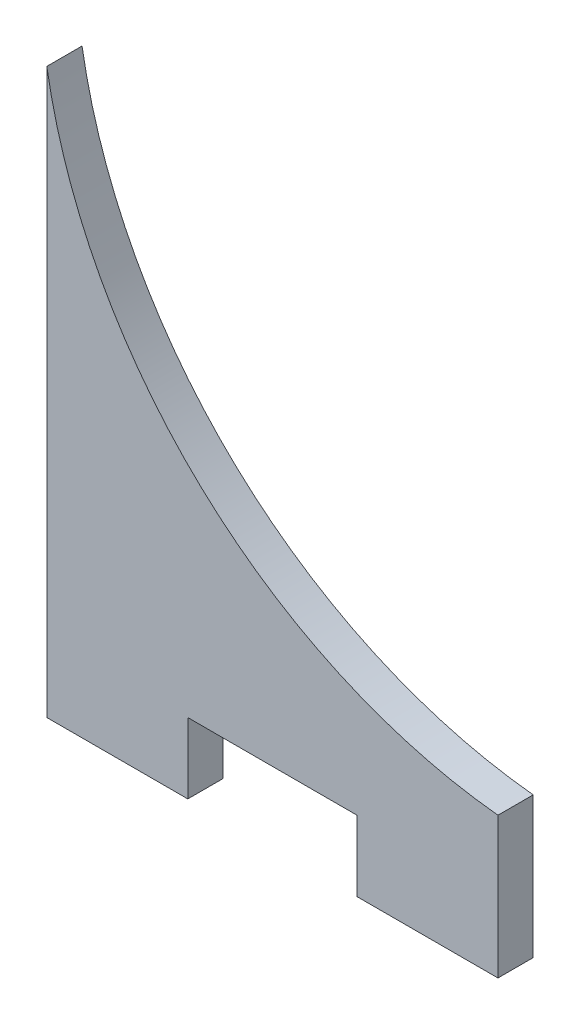
ISO-10303-21;
HEADER;
FILE_DESCRIPTION(('STEP AP214'),'2;1');
FILE_NAME('part.step','',(''),(''),'','','');
FILE_SCHEMA(('AUTOMOTIVE_DESIGN { 1 0 10303 214 1 1 1 1 }'));
ENDSEC;
DATA;
#1=APPLICATION_CONTEXT('core data for automotive mechanical design processes');
#2=APPLICATION_PROTOCOL_DEFINITION('international standard','automotive_design',2000,#1);
#3=PRODUCT_CONTEXT('',#1,'mechanical');
#4=PRODUCT('Part','Part','',(#3));
#5=PRODUCT_RELATED_PRODUCT_CATEGORY('part','',(#4));
#6=PRODUCT_DEFINITION_FORMATION('','',#4);
#7=PRODUCT_DEFINITION_CONTEXT('part definition',#1,'design');
#8=PRODUCT_DEFINITION('design','',#6,#7);
#9=PRODUCT_DEFINITION_SHAPE('','',#8);
#10=(LENGTH_UNIT() NAMED_UNIT(*) SI_UNIT(.MILLI.,.METRE.));
#11=(NAMED_UNIT(*) PLANE_ANGLE_UNIT() SI_UNIT($,.RADIAN.));
#12=(NAMED_UNIT(*) SI_UNIT($,.STERADIAN.) SOLID_ANGLE_UNIT());
#13=UNCERTAINTY_MEASURE_WITH_UNIT(LENGTH_MEASURE(1.E-05),#10,'distance_accuracy_value','');
#14=(GEOMETRIC_REPRESENTATION_CONTEXT(3) GLOBAL_UNCERTAINTY_ASSIGNED_CONTEXT((#13)) GLOBAL_UNIT_ASSIGNED_CONTEXT((#10,
#11,#12)) REPRESENTATION_CONTEXT('',''));
#15=CARTESIAN_POINT('',(0.,0.,0.));
#16=DIRECTION('',(0.,0.,1.));
#17=DIRECTION('',(1.,0.,0.));
#18=AXIS2_PLACEMENT_3D('',#15,#16,#17);
#19=CARTESIAN_POINT('',(90.7978739699901,91.6017322346561,6.35));
#20=DIRECTION('',(0.,0.,-1.));
#21=DIRECTION('',(-1.,0.,0.));
#22=AXIS2_PLACEMENT_3D('',#19,#20,#21);
#23=CYLINDRICAL_SURFACE('',#22,92.0948819060987);
#24=CARTESIAN_POINT('',(90.7978739699901,91.6017322346561,0.));
#25=DIRECTION('',(0.,0.,1.));
#26=DIRECTION('',(1.,0.,0.));
#27=AXIS2_PLACEMENT_3D('',#24,#25,#26);
#28=CIRCLE('',#27,92.0948819060987);
#29=CARTESIAN_POINT('',(0.,76.2,0.));
#30=VERTEX_POINT('',#29);
#31=CARTESIAN_POINT('',(81.28,0.,0.));
#32=VERTEX_POINT('',#31);
#33=EDGE_CURVE('E135',#30,#32,#28,.T.);
#34=ORIENTED_EDGE('',*,*,#33,.F.);
#35=DIRECTION('',(0.,0.,-1.));
#36=VECTOR('',#35,1.);
#37=CARTESIAN_POINT('',(0.,76.2,6.35));
#38=LINE('',#37,#36);
#39=CARTESIAN_POINT('',(0.,76.2,6.35));
#40=VERTEX_POINT('',#39);
#41=EDGE_CURVE('E11',#40,#30,#38,.T.);
#42=ORIENTED_EDGE('',*,*,#41,.F.);
#43=CARTESIAN_POINT('',(90.7978739699901,91.6017322346561,6.35));
#44=DIRECTION('',(0.,0.,1.));
#45=DIRECTION('',(1.,0.,0.));
#46=AXIS2_PLACEMENT_3D('',#43,#44,#45);
#47=CIRCLE('',#46,92.0948819060987);
#48=CARTESIAN_POINT('',(81.28,0.,6.35));
#49=VERTEX_POINT('',#48);
#50=EDGE_CURVE('E152',#40,#49,#47,.T.);
#51=ORIENTED_EDGE('',*,*,#50,.T.);
#52=DIRECTION('',(0.,0.,-1.));
#53=VECTOR('',#52,1.);
#54=CARTESIAN_POINT('',(81.28,0.,6.35));
#55=LINE('',#54,#53);
#56=EDGE_CURVE('E54',#49,#32,#55,.T.);
#57=ORIENTED_EDGE('',*,*,#56,.T.);
#58=EDGE_LOOP('',(#34,#42,#51,#57));
#59=FACE_BOUND('',#58,.T.);
#60=ADVANCED_FACE('F39',(#59),#23,.F.);
#61=CARTESIAN_POINT('',(0.,0.,6.35));
#62=DIRECTION('',(-1.,0.,0.));
#63=DIRECTION('',(0.,0.,1.));
#64=AXIS2_PLACEMENT_3D('',#61,#62,#63);
#65=PLANE('',#64);
#66=DIRECTION('',(0.,1.,0.));
#67=VECTOR('',#66,1.);
#68=CARTESIAN_POINT('',(0.,0.,0.));
#69=LINE('',#68,#67);
#70=CARTESIAN_POINT('',(0.,-25.4,0.));
#71=VERTEX_POINT('',#70);
#72=EDGE_CURVE('E132',#71,#30,#69,.T.);
#73=ORIENTED_EDGE('',*,*,#72,.F.);
#74=DIRECTION('',(0.,0.,-1.));
#75=VECTOR('',#74,1.);
#76=CARTESIAN_POINT('',(0.,-25.4,6.35));
#77=LINE('',#76,#75);
#78=CARTESIAN_POINT('',(0.,-25.4,6.35));
#79=VERTEX_POINT('',#78);
#80=EDGE_CURVE('E50',#79,#71,#77,.T.);
#81=ORIENTED_EDGE('',*,*,#80,.F.);
#82=DIRECTION('',(0.,1.,0.));
#83=VECTOR('',#82,1.);
#84=CARTESIAN_POINT('',(0.,0.,6.35));
#85=LINE('',#84,#83);
#86=EDGE_CURVE('E178',#79,#40,#85,.T.);
#87=ORIENTED_EDGE('',*,*,#86,.T.);
#88=ORIENTED_EDGE('',*,*,#41,.T.);
#89=EDGE_LOOP('',(#73,#81,#87,#88));
#90=FACE_BOUND('',#89,.T.);
#91=ADVANCED_FACE('F170',(#90),#65,.T.);
#92=CARTESIAN_POINT('',(0.,-25.4,6.35));
#93=DIRECTION('',(0.,-1.,0.));
#94=DIRECTION('',(1.,0.,0.));
#95=AXIS2_PLACEMENT_3D('',#92,#93,#94);
#96=PLANE('',#95);
#97=DIRECTION('',(-1.,0.,0.));
#98=VECTOR('',#97,1.);
#99=CARTESIAN_POINT('',(0.,-25.4,0.));
#100=LINE('',#99,#98);
#101=CARTESIAN_POINT('',(25.4,-25.4,0.));
#102=VERTEX_POINT('',#101);
#103=EDGE_CURVE('E140',#102,#71,#100,.T.);
#104=ORIENTED_EDGE('',*,*,#103,.F.);
#105=DIRECTION('',(0.,0.,-1.));
#106=VECTOR('',#105,1.);
#107=CARTESIAN_POINT('',(25.4,-25.4,6.35));
#108=LINE('',#107,#106);
#109=CARTESIAN_POINT('',(25.4,-25.4,6.35));
#110=VERTEX_POINT('',#109);
#111=EDGE_CURVE('E156',#110,#102,#108,.T.);
#112=ORIENTED_EDGE('',*,*,#111,.F.);
#113=DIRECTION('',(-1.,0.,0.));
#114=VECTOR('',#113,1.);
#115=CARTESIAN_POINT('',(0.,-25.4,6.35));
#116=LINE('',#115,#114);
#117=EDGE_CURVE('E165',#110,#79,#116,.T.);
#118=ORIENTED_EDGE('',*,*,#117,.T.);
#119=ORIENTED_EDGE('',*,*,#80,.T.);
#120=EDGE_LOOP('',(#104,#112,#118,#119));
#121=FACE_BOUND('',#120,.T.);
#122=ADVANCED_FACE('F164',(#121),#96,.T.);
#123=CARTESIAN_POINT('',(25.4,0.,6.35));
#124=DIRECTION('',(1.,0.,0.));
#125=DIRECTION('',(0.,0.,-1.));
#126=AXIS2_PLACEMENT_3D('',#123,#124,#125);
#127=PLANE('',#126);
#128=DIRECTION('',(0.,-1.,0.));
#129=VECTOR('',#128,1.);
#130=CARTESIAN_POINT('',(25.4,0.,0.));
#131=LINE('',#130,#129);
#132=CARTESIAN_POINT('',(25.4,-12.7,0.));
#133=VERTEX_POINT('',#132);
#134=EDGE_CURVE('E139',#133,#102,#131,.T.);
#135=ORIENTED_EDGE('',*,*,#134,.F.);
#136=DIRECTION('',(0.,0.,-1.));
#137=VECTOR('',#136,1.);
#138=CARTESIAN_POINT('',(25.4,-12.7,6.35));
#139=LINE('',#138,#137);
#140=CARTESIAN_POINT('',(25.4,-12.7,6.35));
#141=VERTEX_POINT('',#140);
#142=EDGE_CURVE('E157',#141,#133,#139,.T.);
#143=ORIENTED_EDGE('',*,*,#142,.F.);
#144=DIRECTION('',(0.,-1.,0.));
#145=VECTOR('',#144,1.);
#146=CARTESIAN_POINT('',(25.4,0.,6.35));
#147=LINE('',#146,#145);
#148=EDGE_CURVE('E180',#141,#110,#147,.T.);
#149=ORIENTED_EDGE('',*,*,#148,.T.);
#150=ORIENTED_EDGE('',*,*,#111,.T.);
#151=EDGE_LOOP('',(#135,#143,#149,#150));
#152=FACE_BOUND('',#151,.T.);
#153=ADVANCED_FACE('F172',(#152),#127,.T.);
#154=CARTESIAN_POINT('',(0.,-12.7,6.35));
#155=DIRECTION('',(0.,-1.,0.));
#156=DIRECTION('',(1.,0.,0.));
#157=AXIS2_PLACEMENT_3D('',#154,#155,#156);
#158=PLANE('',#157);
#159=DIRECTION('',(-1.,0.,0.));
#160=VECTOR('',#159,1.);
#161=CARTESIAN_POINT('',(0.,-12.7,0.));
#162=LINE('',#161,#160);
#163=CARTESIAN_POINT('',(55.88,-12.7,0.));
#164=VERTEX_POINT('',#163);
#165=EDGE_CURVE('E142',#164,#133,#162,.T.);
#166=ORIENTED_EDGE('',*,*,#165,.F.);
#167=DIRECTION('',(0.,0.,-1.));
#168=VECTOR('',#167,1.);
#169=CARTESIAN_POINT('',(55.88,-12.7,6.35));
#170=LINE('',#169,#168);
#171=CARTESIAN_POINT('',(55.88,-12.7,6.35));
#172=VERTEX_POINT('',#171);
#173=EDGE_CURVE('E114',#172,#164,#170,.T.);
#174=ORIENTED_EDGE('',*,*,#173,.F.);
#175=DIRECTION('',(-1.,0.,0.));
#176=VECTOR('',#175,1.);
#177=CARTESIAN_POINT('',(0.,-12.7,6.35));
#178=LINE('',#177,#176);
#179=EDGE_CURVE('E125',#172,#141,#178,.T.);
#180=ORIENTED_EDGE('',*,*,#179,.T.);
#181=ORIENTED_EDGE('',*,*,#142,.T.);
#182=EDGE_LOOP('',(#166,#174,#180,#181));
#183=FACE_BOUND('',#182,.T.);
#184=ADVANCED_FACE('F182',(#183),#158,.T.);
#185=CARTESIAN_POINT('',(55.88,0.,6.35));
#186=DIRECTION('',(-1.,0.,0.));
#187=DIRECTION('',(0.,0.,1.));
#188=AXIS2_PLACEMENT_3D('',#185,#186,#187);
#189=PLANE('',#188);
#190=DIRECTION('',(0.,1.,0.));
#191=VECTOR('',#190,1.);
#192=CARTESIAN_POINT('',(55.88,0.,0.));
#193=LINE('',#192,#191);
#194=CARTESIAN_POINT('',(55.88,-25.4,0.));
#195=VERTEX_POINT('',#194);
#196=EDGE_CURVE('E110',#195,#164,#193,.T.);
#197=ORIENTED_EDGE('',*,*,#196,.F.);
#198=DIRECTION('',(0.,0.,-1.));
#199=VECTOR('',#198,1.);
#200=CARTESIAN_POINT('',(55.88,-25.4,6.35));
#201=LINE('',#200,#199);
#202=CARTESIAN_POINT('',(55.88,-25.4,6.35));
#203=VERTEX_POINT('',#202);
#204=EDGE_CURVE('E103',#203,#195,#201,.T.);
#205=ORIENTED_EDGE('',*,*,#204,.F.);
#206=DIRECTION('',(0.,1.,0.));
#207=VECTOR('',#206,1.);
#208=CARTESIAN_POINT('',(55.88,0.,6.35));
#209=LINE('',#208,#207);
#210=EDGE_CURVE('E109',#203,#172,#209,.T.);
#211=ORIENTED_EDGE('',*,*,#210,.T.);
#212=ORIENTED_EDGE('',*,*,#173,.T.);
#213=EDGE_LOOP('',(#197,#205,#211,#212));
#214=FACE_BOUND('',#213,.T.);
#215=ADVANCED_FACE('F107',(#214),#189,.T.);
#216=CARTESIAN_POINT('',(0.,-25.4,6.35));
#217=DIRECTION('',(0.,-1.,0.));
#218=DIRECTION('',(1.,0.,0.));
#219=AXIS2_PLACEMENT_3D('',#216,#217,#218);
#220=PLANE('',#219);
#221=DIRECTION('',(-1.,0.,0.));
#222=VECTOR('',#221,1.);
#223=CARTESIAN_POINT('',(0.,-25.4,0.));
#224=LINE('',#223,#222);
#225=CARTESIAN_POINT('',(81.28,-25.4,0.));
#226=VERTEX_POINT('',#225);
#227=EDGE_CURVE('E150',#226,#195,#224,.T.);
#228=ORIENTED_EDGE('',*,*,#227,.F.);
#229=DIRECTION('',(0.,0.,-1.));
#230=VECTOR('',#229,1.);
#231=CARTESIAN_POINT('',(81.28,-25.4,6.35));
#232=LINE('',#231,#230);
#233=CARTESIAN_POINT('',(81.28,-25.4,6.35));
#234=VERTEX_POINT('',#233);
#235=EDGE_CURVE('E79',#234,#226,#232,.T.);
#236=ORIENTED_EDGE('',*,*,#235,.F.);
#237=DIRECTION('',(-1.,0.,0.));
#238=VECTOR('',#237,1.);
#239=CARTESIAN_POINT('',(0.,-25.4,6.35));
#240=LINE('',#239,#238);
#241=EDGE_CURVE('E123',#234,#203,#240,.T.);
#242=ORIENTED_EDGE('',*,*,#241,.T.);
#243=ORIENTED_EDGE('',*,*,#204,.T.);
#244=EDGE_LOOP('',(#228,#236,#242,#243));
#245=FACE_BOUND('',#244,.T.);
#246=ADVANCED_FACE('F128',(#245),#220,.T.);
#247=CARTESIAN_POINT('',(81.28,0.,6.35));
#248=DIRECTION('',(1.,0.,0.));
#249=DIRECTION('',(0.,0.,-1.));
#250=AXIS2_PLACEMENT_3D('',#247,#248,#249);
#251=PLANE('',#250);
#252=DIRECTION('',(0.,-1.,0.));
#253=VECTOR('',#252,1.);
#254=CARTESIAN_POINT('',(81.28,0.,0.));
#255=LINE('',#254,#253);
#256=EDGE_CURVE('E146',#32,#226,#255,.T.);
#257=ORIENTED_EDGE('',*,*,#256,.F.);
#258=ORIENTED_EDGE('',*,*,#56,.F.);
#259=DIRECTION('',(0.,-1.,0.));
#260=VECTOR('',#259,1.);
#261=CARTESIAN_POINT('',(81.28,0.,6.35));
#262=LINE('',#261,#260);
#263=EDGE_CURVE('E130',#49,#234,#262,.T.);
#264=ORIENTED_EDGE('',*,*,#263,.T.);
#265=ORIENTED_EDGE('',*,*,#235,.T.);
#266=EDGE_LOOP('',(#257,#258,#264,#265));
#267=FACE_BOUND('',#266,.T.);
#268=ADVANCED_FACE('F184',(#267),#251,.T.);
#269=CARTESIAN_POINT('',(0.,0.,6.35));
#270=DIRECTION('',(0.,0.,1.));
#271=DIRECTION('',(1.,0.,0.));
#272=AXIS2_PLACEMENT_3D('',#269,#270,#271);
#273=PLANE('',#272);
#274=ORIENTED_EDGE('',*,*,#50,.F.);
#275=ORIENTED_EDGE('',*,*,#86,.F.);
#276=ORIENTED_EDGE('',*,*,#117,.F.);
#277=ORIENTED_EDGE('',*,*,#148,.F.);
#278=ORIENTED_EDGE('',*,*,#179,.F.);
#279=ORIENTED_EDGE('',*,*,#210,.F.);
#280=ORIENTED_EDGE('',*,*,#241,.F.);
#281=ORIENTED_EDGE('',*,*,#263,.F.);
#282=EDGE_LOOP('',(#274,#275,#276,#277,#278,#279,#280,#281));
#283=FACE_BOUND('',#282,.T.);
#284=ADVANCED_FACE('F118',(#283),#273,.T.);
#285=CARTESIAN_POINT('',(0.,0.,0.));
#286=DIRECTION('',(0.,0.,1.));
#287=DIRECTION('',(1.,0.,0.));
#288=AXIS2_PLACEMENT_3D('',#285,#286,#287);
#289=PLANE('',#288);
#290=ORIENTED_EDGE('',*,*,#33,.T.);
#291=ORIENTED_EDGE('',*,*,#256,.T.);
#292=ORIENTED_EDGE('',*,*,#227,.T.);
#293=ORIENTED_EDGE('',*,*,#196,.T.);
#294=ORIENTED_EDGE('',*,*,#165,.T.);
#295=ORIENTED_EDGE('',*,*,#134,.T.);
#296=ORIENTED_EDGE('',*,*,#103,.T.);
#297=ORIENTED_EDGE('',*,*,#72,.T.);
#298=EDGE_LOOP('',(#290,#291,#292,#293,#294,#295,#296,#297));
#299=FACE_BOUND('',#298,.T.);
#300=ADVANCED_FACE('F173',(#299),#289,.F.);
#301=CLOSED_SHELL('',(#60,#91,#122,#153,#184,#215,#246,#268,#284,#300));
#302=MANIFOLD_SOLID_BREP('B2',#301);
#303=ADVANCED_BREP_SHAPE_REPRESENTATION('',(#18,#302),#14);
#304=SHAPE_DEFINITION_REPRESENTATION(#9,#303);
ENDSEC;
END-ISO-10303-21;
